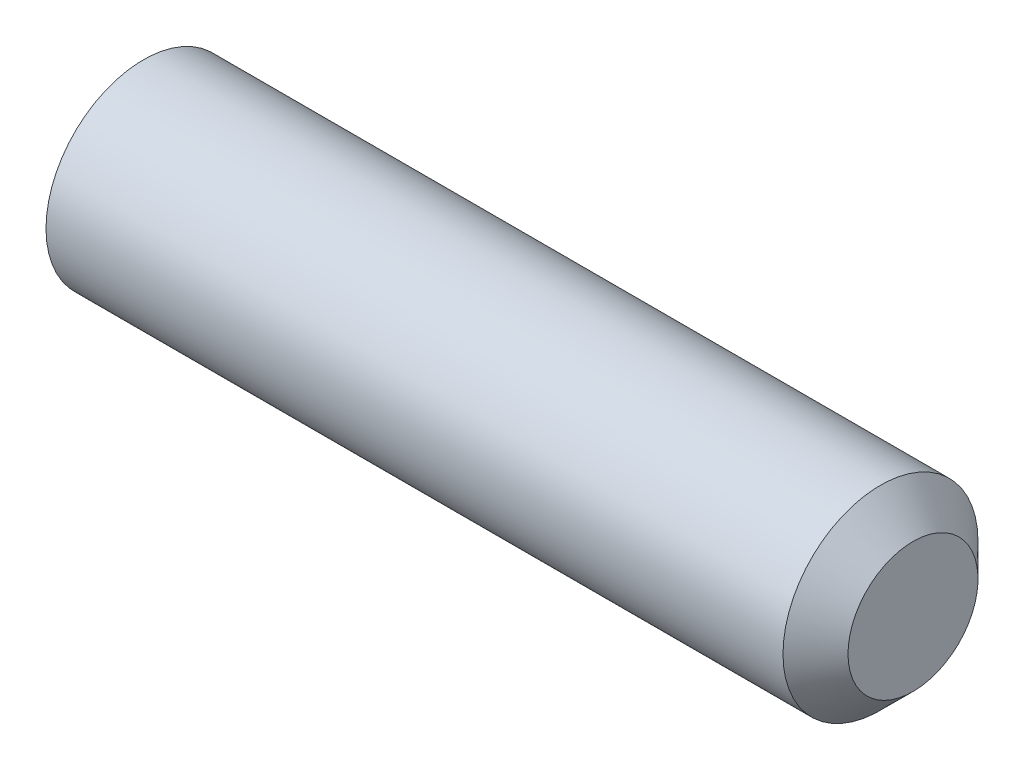
ISO-10303-21;
HEADER;
FILE_DESCRIPTION(('STEP AP214'),'2;1');
FILE_NAME('part.step','',(''),(''),'','','');
FILE_SCHEMA(('AUTOMOTIVE_DESIGN { 1 0 10303 214 1 1 1 1 }'));
ENDSEC;
DATA;
#1=APPLICATION_CONTEXT('core data for automotive mechanical design processes');
#2=APPLICATION_PROTOCOL_DEFINITION('international standard','automotive_design',2000,#1);
#3=PRODUCT_CONTEXT('',#1,'mechanical');
#4=PRODUCT('Part','Part','',(#3));
#5=PRODUCT_RELATED_PRODUCT_CATEGORY('part','',(#4));
#6=PRODUCT_DEFINITION_FORMATION('','',#4);
#7=PRODUCT_DEFINITION_CONTEXT('part definition',#1,'design');
#8=PRODUCT_DEFINITION('design','',#6,#7);
#9=PRODUCT_DEFINITION_SHAPE('','',#8);
#10=(LENGTH_UNIT() NAMED_UNIT(*) SI_UNIT(.MILLI.,.METRE.));
#11=(NAMED_UNIT(*) PLANE_ANGLE_UNIT() SI_UNIT($,.RADIAN.));
#12=(NAMED_UNIT(*) SI_UNIT($,.STERADIAN.) SOLID_ANGLE_UNIT());
#13=UNCERTAINTY_MEASURE_WITH_UNIT(LENGTH_MEASURE(1.E-05),#10,'distance_accuracy_value','');
#14=(GEOMETRIC_REPRESENTATION_CONTEXT(3) GLOBAL_UNCERTAINTY_ASSIGNED_CONTEXT((#13)) GLOBAL_UNIT_ASSIGNED_CONTEXT((#10,
#11,#12)) REPRESENTATION_CONTEXT('',''));
#15=CARTESIAN_POINT('',(0.,0.,0.));
#16=DIRECTION('',(0.,0.,1.));
#17=DIRECTION('',(1.,0.,0.));
#18=AXIS2_PLACEMENT_3D('',#15,#16,#17);
#19=CARTESIAN_POINT('',(0.,0.,0.));
#20=DIRECTION('',(-1.,0.,0.));
#21=DIRECTION('',(0.,0.,1.));
#22=AXIS2_PLACEMENT_3D('',#19,#20,#21);
#23=PLANE('',#22);
#24=CARTESIAN_POINT('',(0.,0.,0.));
#25=DIRECTION('',(-1.,0.,0.));
#26=DIRECTION('',(0.,0.,1.));
#27=AXIS2_PLACEMENT_3D('',#24,#25,#26);
#28=CIRCLE('',#27,1.2195);
#29=CARTESIAN_POINT('',(0.,0.,1.2195));
#30=VERTEX_POINT('',#29);
#31=EDGE_CURVE('E137',#30,#30,#28,.T.);
#32=ORIENTED_EDGE('',*,*,#31,.T.);
#33=EDGE_LOOP('',(#32));
#34=FACE_BOUND('',#33,.T.);
#35=DIRECTION('',(0.,0.,-1.));
#36=VECTOR('',#35,1.);
#37=CARTESIAN_POINT('',(0.,0.750000000000003,0.433012701892216));
#38=LINE('',#37,#36);
#39=CARTESIAN_POINT('',(0.,0.750000000000003,0.433012701892216));
#40=VERTEX_POINT('',#39);
#41=CARTESIAN_POINT('',(0.,0.750000000000003,-0.433012701892222));
#42=VERTEX_POINT('',#41);
#43=EDGE_CURVE('E128',#40,#42,#38,.T.);
#44=ORIENTED_EDGE('',*,*,#43,.F.);
#45=DIRECTION('',(0.,-0.866025403784439,0.5));
#46=VECTOR('',#45,1.);
#47=CARTESIAN_POINT('',(0.,0.750000000000003,0.433012701892216));
#48=LINE('',#47,#46);
#49=CARTESIAN_POINT('',(0.,0.,0.866025403784435));
#50=VERTEX_POINT('',#49);
#51=EDGE_CURVE('E50',#40,#50,#48,.T.);
#52=ORIENTED_EDGE('',*,*,#51,.T.);
#53=DIRECTION('',(0.,0.866025403784439,0.5));
#54=VECTOR('',#53,1.);
#55=CARTESIAN_POINT('',(0.,-0.749999999999996,0.433012701892216));
#56=LINE('',#55,#54);
#57=CARTESIAN_POINT('',(0.,-0.749999999999996,0.433012701892216));
#58=VERTEX_POINT('',#57);
#59=EDGE_CURVE('E119',#58,#50,#56,.T.);
#60=ORIENTED_EDGE('',*,*,#59,.F.);
#61=DIRECTION('',(0.,0.,-1.));
#62=VECTOR('',#61,1.);
#63=CARTESIAN_POINT('',(0.,-0.749999999999996,0.433012701892216));
#64=LINE('',#63,#62);
#65=CARTESIAN_POINT('',(0.,-0.749999999999996,-0.433012701892222));
#66=VERTEX_POINT('',#65);
#67=EDGE_CURVE('E122',#58,#66,#64,.T.);
#68=ORIENTED_EDGE('',*,*,#67,.T.);
#69=DIRECTION('',(0.,0.866025403784438,-0.500000000000001));
#70=VECTOR('',#69,1.);
#71=CARTESIAN_POINT('',(0.,-0.749999999999996,-0.433012701892222));
#72=LINE('',#71,#70);
#73=CARTESIAN_POINT('',(0.,0.,-0.866025403784441));
#74=VERTEX_POINT('',#73);
#75=EDGE_CURVE('E125',#66,#74,#72,.T.);
#76=ORIENTED_EDGE('',*,*,#75,.T.);
#77=DIRECTION('',(0.,-0.866025403784439,-0.5));
#78=VECTOR('',#77,1.);
#79=CARTESIAN_POINT('',(0.,0.750000000000003,-0.433012701892222));
#80=LINE('',#79,#78);
#81=EDGE_CURVE('E108',#42,#74,#80,.T.);
#82=ORIENTED_EDGE('',*,*,#81,.F.);
#83=EDGE_LOOP('',(#44,#52,#60,#68,#76,#82));
#84=FACE_BOUND('',#83,.T.);
#85=ADVANCED_FACE('F35',(#34,#84),#23,.T.);
#86=CARTESIAN_POINT('',(12.,1.,0.));
#87=DIRECTION('',(1.,0.,0.));
#88=DIRECTION('',(0.,0.,-1.));
#89=AXIS2_PLACEMENT_3D('',#86,#87,#88);
#90=PLANE('',#89);
#91=CARTESIAN_POINT('',(12.,0.,0.));
#92=DIRECTION('',(-1.,0.,0.));
#93=DIRECTION('',(0.,0.,1.));
#94=AXIS2_PLACEMENT_3D('',#91,#92,#93);
#95=CIRCLE('',#94,1.);
#96=CARTESIAN_POINT('',(12.,0.,1.));
#97=VERTEX_POINT('',#96);
#98=EDGE_CURVE('E11',#97,#97,#95,.T.);
#99=ORIENTED_EDGE('',*,*,#98,.F.);
#100=EDGE_LOOP('',(#99));
#101=FACE_BOUND('',#100,.T.);
#102=ADVANCED_FACE('F37',(#101),#90,.T.);
#103=CARTESIAN_POINT('',(11.5,0.,0.));
#104=DIRECTION('',(-1.,0.,0.));
#105=DIRECTION('',(0.,0.,1.));
#106=AXIS2_PLACEMENT_3D('',#103,#104,#105);
#107=CONICAL_SURFACE('',#106,1.5,0.78539816339745);
#108=ORIENTED_EDGE('',*,*,#98,.T.);
#109=EDGE_LOOP('',(#108));
#110=FACE_BOUND('',#109,.T.);
#111=CARTESIAN_POINT('',(11.5,0.,0.));
#112=DIRECTION('',(-1.,0.,0.));
#113=DIRECTION('',(0.,0.,1.));
#114=AXIS2_PLACEMENT_3D('',#111,#112,#113);
#115=CIRCLE('',#114,1.5);
#116=CARTESIAN_POINT('',(11.5,0.,1.5));
#117=VERTEX_POINT('',#116);
#118=EDGE_CURVE('E43',#117,#117,#115,.T.);
#119=ORIENTED_EDGE('',*,*,#118,.F.);
#120=EDGE_LOOP('',(#119));
#121=FACE_BOUND('',#120,.T.);
#122=ADVANCED_FACE('F148',(#110,#121),#107,.T.);
#123=CARTESIAN_POINT('',(-12.7,0.,0.));
#124=DIRECTION('',(-1.,0.,0.));
#125=DIRECTION('',(0.,0.,1.));
#126=AXIS2_PLACEMENT_3D('',#123,#124,#125);
#127=CYLINDRICAL_SURFACE('',#126,1.5);
#128=ORIENTED_EDGE('',*,*,#118,.T.);
#129=EDGE_LOOP('',(#128));
#130=FACE_BOUND('',#129,.T.);
#131=CARTESIAN_POINT('',(0.161946750507689,0.,0.));
#132=DIRECTION('',(-1.,0.,0.));
#133=DIRECTION('',(0.,0.,1.));
#134=AXIS2_PLACEMENT_3D('',#131,#132,#133);
#135=CIRCLE('',#134,1.5);
#136=CARTESIAN_POINT('',(0.161946750507689,0.,1.5));
#137=VERTEX_POINT('',#136);
#138=EDGE_CURVE('E140',#137,#137,#135,.T.);
#139=ORIENTED_EDGE('',*,*,#138,.F.);
#140=EDGE_LOOP('',(#139));
#141=FACE_BOUND('',#140,.T.);
#142=ADVANCED_FACE('F145',(#130,#141),#127,.T.);
#143=CARTESIAN_POINT('',(0.,0.,0.));
#144=DIRECTION('',(1.,0.,0.));
#145=DIRECTION('',(0.,0.,-1.));
#146=AXIS2_PLACEMENT_3D('',#143,#144,#145);
#147=CONICAL_SURFACE('',#146,1.2195,1.0471975511966);
#148=ORIENTED_EDGE('',*,*,#138,.T.);
#149=EDGE_LOOP('',(#148));
#150=FACE_BOUND('',#149,.T.);
#151=ORIENTED_EDGE('',*,*,#31,.F.);
#152=EDGE_LOOP('',(#151));
#153=FACE_BOUND('',#152,.T.);
#154=ADVANCED_FACE('F155',(#150,#153),#147,.T.);
#155=CARTESIAN_POINT('',(2.1,0.750000000000003,0.433012701892216));
#156=DIRECTION('',(0.,-0.5,-0.866025403784438));
#157=DIRECTION('',(0.,0.866025403784439,-0.5));
#158=AXIS2_PLACEMENT_3D('',#155,#156,#157);
#159=PLANE('',#158);
#160=ORIENTED_EDGE('',*,*,#51,.F.);
#161=DIRECTION('',(-1.,0.,0.));
#162=VECTOR('',#161,1.);
#163=CARTESIAN_POINT('',(2.1,0.750000000000003,0.433012701892216));
#164=LINE('',#163,#162);
#165=CARTESIAN_POINT('',(2.1,0.750000000000003,0.433012701892216));
#166=VERTEX_POINT('',#165);
#167=EDGE_CURVE('E55',#166,#40,#164,.T.);
#168=ORIENTED_EDGE('',*,*,#167,.F.);
#169=DIRECTION('',(0.,-0.866025403784439,0.5));
#170=VECTOR('',#169,1.);
#171=CARTESIAN_POINT('',(2.1,0.750000000000003,0.433012701892216));
#172=LINE('',#171,#170);
#173=CARTESIAN_POINT('',(2.1,0.,0.866025403784435));
#174=VERTEX_POINT('',#173);
#175=EDGE_CURVE('E82',#166,#174,#172,.T.);
#176=ORIENTED_EDGE('',*,*,#175,.T.);
#177=DIRECTION('',(-1.,0.,0.));
#178=VECTOR('',#177,1.);
#179=CARTESIAN_POINT('',(2.1,0.,0.866025403784435));
#180=LINE('',#179,#178);
#181=EDGE_CURVE('E135',#174,#50,#180,.T.);
#182=ORIENTED_EDGE('',*,*,#181,.T.);
#183=EDGE_LOOP('',(#160,#168,#176,#182));
#184=FACE_BOUND('',#183,.T.);
#185=ADVANCED_FACE('F166',(#184),#159,.T.);
#186=CARTESIAN_POINT('',(2.1,-0.749999999999996,0.433012701892216));
#187=DIRECTION('',(0.,-0.5,0.866025403784439));
#188=DIRECTION('',(0.,-0.866025403784439,-0.5));
#189=AXIS2_PLACEMENT_3D('',#186,#187,#188);
#190=PLANE('',#189);
#191=ORIENTED_EDGE('',*,*,#59,.T.);
#192=ORIENTED_EDGE('',*,*,#181,.F.);
#193=DIRECTION('',(0.,0.866025403784439,0.5));
#194=VECTOR('',#193,1.);
#195=CARTESIAN_POINT('',(2.1,-0.749999999999996,0.433012701892216));
#196=LINE('',#195,#194);
#197=CARTESIAN_POINT('',(2.1,-0.749999999999996,0.433012701892216));
#198=VERTEX_POINT('',#197);
#199=EDGE_CURVE('E268',#198,#174,#196,.T.);
#200=ORIENTED_EDGE('',*,*,#199,.F.);
#201=DIRECTION('',(-1.,0.,0.));
#202=VECTOR('',#201,1.);
#203=CARTESIAN_POINT('',(2.1,-0.749999999999996,0.433012701892216));
#204=LINE('',#203,#202);
#205=EDGE_CURVE('E133',#198,#58,#204,.T.);
#206=ORIENTED_EDGE('',*,*,#205,.T.);
#207=EDGE_LOOP('',(#191,#192,#200,#206));
#208=FACE_BOUND('',#207,.T.);
#209=ADVANCED_FACE('F173',(#208),#190,.F.);
#210=CARTESIAN_POINT('',(2.1,-0.749999999999996,0.433012701892216));
#211=DIRECTION('',(0.,1.,0.));
#212=DIRECTION('',(0.,0.,1.));
#213=AXIS2_PLACEMENT_3D('',#210,#211,#212);
#214=PLANE('',#213);
#215=ORIENTED_EDGE('',*,*,#67,.F.);
#216=ORIENTED_EDGE('',*,*,#205,.F.);
#217=DIRECTION('',(0.,0.,-1.));
#218=VECTOR('',#217,1.);
#219=CARTESIAN_POINT('',(2.1,-0.749999999999996,0.433012701892216));
#220=LINE('',#219,#218);
#221=CARTESIAN_POINT('',(2.1,-0.749999999999996,-0.433012701892222));
#222=VERTEX_POINT('',#221);
#223=EDGE_CURVE('E103',#198,#222,#220,.T.);
#224=ORIENTED_EDGE('',*,*,#223,.T.);
#225=DIRECTION('',(-1.,0.,0.));
#226=VECTOR('',#225,1.);
#227=CARTESIAN_POINT('',(2.1,-0.749999999999996,-0.433012701892222));
#228=LINE('',#227,#226);
#229=EDGE_CURVE('E98',#222,#66,#228,.T.);
#230=ORIENTED_EDGE('',*,*,#229,.T.);
#231=EDGE_LOOP('',(#215,#216,#224,#230));
#232=FACE_BOUND('',#231,.T.);
#233=ADVANCED_FACE('F180',(#232),#214,.T.);
#234=CARTESIAN_POINT('',(2.1,-0.749999999999996,-0.433012701892222));
#235=DIRECTION('',(0.,0.500000000000001,0.866025403784438));
#236=DIRECTION('',(0.,-0.866025403784438,0.500000000000001));
#237=AXIS2_PLACEMENT_3D('',#234,#235,#236);
#238=PLANE('',#237);
#239=ORIENTED_EDGE('',*,*,#75,.F.);
#240=ORIENTED_EDGE('',*,*,#229,.F.);
#241=DIRECTION('',(0.,0.866025403784438,-0.500000000000001));
#242=VECTOR('',#241,1.);
#243=CARTESIAN_POINT('',(2.1,-0.749999999999996,-0.433012701892222));
#244=LINE('',#243,#242);
#245=CARTESIAN_POINT('',(2.1,0.,-0.866025403784441));
#246=VERTEX_POINT('',#245);
#247=EDGE_CURVE('E93',#222,#246,#244,.T.);
#248=ORIENTED_EDGE('',*,*,#247,.T.);
#249=DIRECTION('',(-1.,0.,0.));
#250=VECTOR('',#249,1.);
#251=CARTESIAN_POINT('',(2.1,0.,-0.866025403784441));
#252=LINE('',#251,#250);
#253=EDGE_CURVE('E97',#246,#74,#252,.T.);
#254=ORIENTED_EDGE('',*,*,#253,.T.);
#255=EDGE_LOOP('',(#239,#240,#248,#254));
#256=FACE_BOUND('',#255,.T.);
#257=ADVANCED_FACE('F96',(#256),#238,.T.);
#258=CARTESIAN_POINT('',(2.1,0.750000000000003,-0.433012701892222));
#259=DIRECTION('',(0.,0.5,-0.866025403784439));
#260=DIRECTION('',(0.,0.866025403784439,0.5));
#261=AXIS2_PLACEMENT_3D('',#258,#259,#260);
#262=PLANE('',#261);
#263=ORIENTED_EDGE('',*,*,#81,.T.);
#264=ORIENTED_EDGE('',*,*,#253,.F.);
#265=DIRECTION('',(0.,-0.866025403784439,-0.5));
#266=VECTOR('',#265,1.);
#267=CARTESIAN_POINT('',(2.1,0.750000000000003,-0.433012701892222));
#268=LINE('',#267,#266);
#269=CARTESIAN_POINT('',(2.1,0.750000000000003,-0.433012701892222));
#270=VERTEX_POINT('',#269);
#271=EDGE_CURVE('E102',#270,#246,#268,.T.);
#272=ORIENTED_EDGE('',*,*,#271,.F.);
#273=DIRECTION('',(-1.,0.,0.));
#274=VECTOR('',#273,1.);
#275=CARTESIAN_POINT('',(2.1,0.750000000000003,-0.433012701892222));
#276=LINE('',#275,#274);
#277=EDGE_CURVE('E78',#270,#42,#276,.T.);
#278=ORIENTED_EDGE('',*,*,#277,.T.);
#279=EDGE_LOOP('',(#263,#264,#272,#278));
#280=FACE_BOUND('',#279,.T.);
#281=ADVANCED_FACE('F105',(#280),#262,.F.);
#282=CARTESIAN_POINT('',(2.1,0.750000000000003,0.433012701892216));
#283=DIRECTION('',(0.,1.,0.));
#284=DIRECTION('',(0.,0.,1.));
#285=AXIS2_PLACEMENT_3D('',#282,#283,#284);
#286=PLANE('',#285);
#287=ORIENTED_EDGE('',*,*,#43,.T.);
#288=ORIENTED_EDGE('',*,*,#277,.F.);
#289=DIRECTION('',(0.,0.,-1.));
#290=VECTOR('',#289,1.);
#291=CARTESIAN_POINT('',(2.1,0.750000000000003,0.433012701892216));
#292=LINE('',#291,#290);
#293=EDGE_CURVE('E113',#166,#270,#292,.T.);
#294=ORIENTED_EDGE('',*,*,#293,.F.);
#295=ORIENTED_EDGE('',*,*,#167,.T.);
#296=EDGE_LOOP('',(#287,#288,#294,#295));
#297=FACE_BOUND('',#296,.T.);
#298=ADVANCED_FACE('F192',(#297),#286,.F.);
#299=CARTESIAN_POINT('',(2.1,1.5,0.));
#300=DIRECTION('',(1.,0.,0.));
#301=DIRECTION('',(0.,0.,-1.));
#302=AXIS2_PLACEMENT_3D('',#299,#300,#301);
#303=PLANE('',#302);
#304=ORIENTED_EDGE('',*,*,#175,.F.);
#305=ORIENTED_EDGE('',*,*,#293,.T.);
#306=ORIENTED_EDGE('',*,*,#271,.T.);
#307=ORIENTED_EDGE('',*,*,#247,.F.);
#308=ORIENTED_EDGE('',*,*,#223,.F.);
#309=ORIENTED_EDGE('',*,*,#199,.T.);
#310=EDGE_LOOP('',(#304,#305,#306,#307,#308,#309));
#311=FACE_BOUND('',#310,.T.);
#312=ADVANCED_FACE('F111',(#311),#303,.F.);
#313=CLOSED_SHELL('',(#85,#102,#122,#142,#154,#185,#209,#233,#257,#281,#298,#312));
#314=MANIFOLD_SOLID_BREP('B2',#313);
#315=ADVANCED_BREP_SHAPE_REPRESENTATION('',(#18,#314),#14);
#316=SHAPE_DEFINITION_REPRESENTATION(#9,#315);
ENDSEC;
END-ISO-10303-21;
